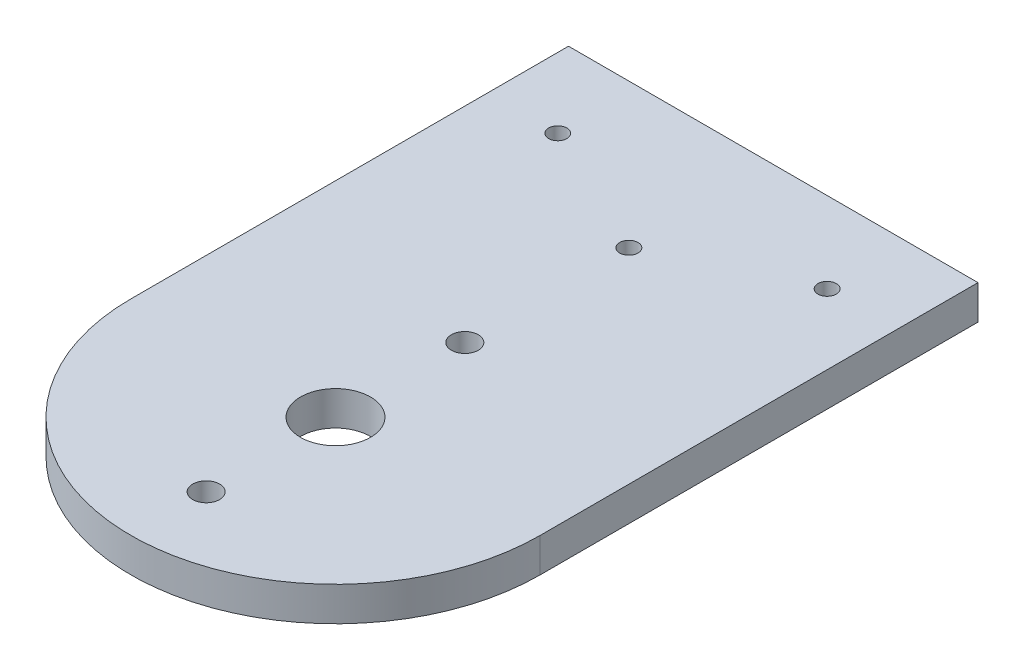
ISO-10303-21;
HEADER;
FILE_DESCRIPTION(('STEP AP214'),'2;1');
FILE_NAME('part.step','',(''),(''),'','','');
FILE_SCHEMA(('AUTOMOTIVE_DESIGN { 1 0 10303 214 1 1 1 1 }'));
ENDSEC;
DATA;
#1=APPLICATION_CONTEXT('core data for automotive mechanical design processes');
#2=APPLICATION_PROTOCOL_DEFINITION('international standard','automotive_design',2000,#1);
#3=PRODUCT_CONTEXT('',#1,'mechanical');
#4=PRODUCT('Part','Part','',(#3));
#5=PRODUCT_RELATED_PRODUCT_CATEGORY('part','',(#4));
#6=PRODUCT_DEFINITION_FORMATION('','',#4);
#7=PRODUCT_DEFINITION_CONTEXT('part definition',#1,'design');
#8=PRODUCT_DEFINITION('design','',#6,#7);
#9=PRODUCT_DEFINITION_SHAPE('','',#8);
#10=(LENGTH_UNIT() NAMED_UNIT(*) SI_UNIT(.MILLI.,.METRE.));
#11=(NAMED_UNIT(*) PLANE_ANGLE_UNIT() SI_UNIT($,.RADIAN.));
#12=(NAMED_UNIT(*) SI_UNIT($,.STERADIAN.) SOLID_ANGLE_UNIT());
#13=UNCERTAINTY_MEASURE_WITH_UNIT(LENGTH_MEASURE(1.E-05),#10,'distance_accuracy_value','');
#14=(GEOMETRIC_REPRESENTATION_CONTEXT(3) GLOBAL_UNCERTAINTY_ASSIGNED_CONTEXT((#13)) GLOBAL_UNIT_ASSIGNED_CONTEXT((#10,
#11,#12)) REPRESENTATION_CONTEXT('',''));
#15=CARTESIAN_POINT('',(0.,0.,0.));
#16=DIRECTION('',(0.,0.,1.));
#17=DIRECTION('',(1.,0.,0.));
#18=AXIS2_PLACEMENT_3D('',#15,#16,#17);
#19=CARTESIAN_POINT('',(-38.,-15.,90.2));
#20=DIRECTION('',(1.,0.,0.));
#21=DIRECTION('',(0.,0.,-1.));
#22=AXIS2_PLACEMENT_3D('',#19,#20,#21);
#23=PLANE('',#22);
#24=DIRECTION('',(0.,0.,1.));
#25=VECTOR('',#24,1.);
#26=CARTESIAN_POINT('',(-38.,-21.35,90.2));
#27=LINE('',#26,#25);
#28=CARTESIAN_POINT('',(-38.,-21.35,90.2));
#29=VERTEX_POINT('',#28);
#30=CARTESIAN_POINT('',(-38.,-21.35,171.45));
#31=VERTEX_POINT('',#30);
#32=EDGE_CURVE('E94',#29,#31,#27,.T.);
#33=ORIENTED_EDGE('',*,*,#32,.T.);
#34=DIRECTION('',(0.,-1.,0.));
#35=VECTOR('',#34,1.);
#36=CARTESIAN_POINT('',(-38.,-15.,171.45));
#37=LINE('',#36,#35);
#38=CARTESIAN_POINT('',(-38.,-15.,171.45));
#39=VERTEX_POINT('',#38);
#40=EDGE_CURVE('E11',#39,#31,#37,.T.);
#41=ORIENTED_EDGE('',*,*,#40,.F.);
#42=DIRECTION('',(0.,0.,1.));
#43=VECTOR('',#42,1.);
#44=CARTESIAN_POINT('',(-38.,-15.,90.2));
#45=LINE('',#44,#43);
#46=CARTESIAN_POINT('',(-38.,-15.,90.2));
#47=VERTEX_POINT('',#46);
#48=EDGE_CURVE('E86',#47,#39,#45,.T.);
#49=ORIENTED_EDGE('',*,*,#48,.F.);
#50=DIRECTION('',(0.,-1.,0.));
#51=VECTOR('',#50,1.);
#52=CARTESIAN_POINT('',(-38.,-15.,90.2));
#53=LINE('',#52,#51);
#54=EDGE_CURVE('E83',#47,#29,#53,.T.);
#55=ORIENTED_EDGE('',*,*,#54,.T.);
#56=EDGE_LOOP('',(#33,#41,#49,#55));
#57=FACE_BOUND('',#56,.T.);
#58=ADVANCED_FACE('F43',(#57),#23,.F.);
#59=CARTESIAN_POINT('',(38.,-15.,90.2));
#60=DIRECTION('',(-1.,0.,0.));
#61=DIRECTION('',(0.,0.,1.));
#62=AXIS2_PLACEMENT_3D('',#59,#60,#61);
#63=PLANE('',#62);
#64=DIRECTION('',(0.,0.,-1.));
#65=VECTOR('',#64,1.);
#66=CARTESIAN_POINT('',(38.,-21.35,90.2));
#67=LINE('',#66,#65);
#68=CARTESIAN_POINT('',(38.,-21.35,171.45));
#69=VERTEX_POINT('',#68);
#70=CARTESIAN_POINT('',(38.,-21.35,90.2));
#71=VERTEX_POINT('',#70);
#72=EDGE_CURVE('E75',#69,#71,#67,.T.);
#73=ORIENTED_EDGE('',*,*,#72,.T.);
#74=DIRECTION('',(0.,-1.,0.));
#75=VECTOR('',#74,1.);
#76=CARTESIAN_POINT('',(38.,-15.,90.2));
#77=LINE('',#76,#75);
#78=CARTESIAN_POINT('',(38.,-15.,90.2));
#79=VERTEX_POINT('',#78);
#80=EDGE_CURVE('E82',#79,#71,#77,.T.);
#81=ORIENTED_EDGE('',*,*,#80,.F.);
#82=DIRECTION('',(0.,0.,-1.));
#83=VECTOR('',#82,1.);
#84=CARTESIAN_POINT('',(38.,-15.,90.2));
#85=LINE('',#84,#83);
#86=CARTESIAN_POINT('',(38.,-15.,171.45));
#87=VERTEX_POINT('',#86);
#88=EDGE_CURVE('E108',#87,#79,#85,.T.);
#89=ORIENTED_EDGE('',*,*,#88,.F.);
#90=DIRECTION('',(0.,-1.,0.));
#91=VECTOR('',#90,1.);
#92=CARTESIAN_POINT('',(38.,-15.,171.45));
#93=LINE('',#92,#91);
#94=EDGE_CURVE('E51',#87,#69,#93,.T.);
#95=ORIENTED_EDGE('',*,*,#94,.T.);
#96=EDGE_LOOP('',(#73,#81,#89,#95));
#97=FACE_BOUND('',#96,.T.);
#98=ADVANCED_FACE('F106',(#97),#63,.F.);
#99=CARTESIAN_POINT('',(-38.,-15.,90.2));
#100=DIRECTION('',(0.,0.,1.));
#101=DIRECTION('',(1.,0.,0.));
#102=AXIS2_PLACEMENT_3D('',#99,#100,#101);
#103=PLANE('',#102);
#104=CARTESIAN_POINT('',(-30.,-18.175,90.2));
#105=DIRECTION('',(0.,0.,1.));
#106=DIRECTION('',(1.,0.,0.));
#107=AXIS2_PLACEMENT_3D('',#104,#105,#106);
#108=CIRCLE('',#107,2.);
#109=CARTESIAN_POINT('',(-28.,-18.175,90.2));
#110=VERTEX_POINT('',#109);
#111=EDGE_CURVE('E143',#110,#110,#108,.T.);
#112=ORIENTED_EDGE('',*,*,#111,.T.);
#113=EDGE_LOOP('',(#112));
#114=FACE_BOUND('',#113,.T.);
#115=CARTESIAN_POINT('',(30.,-18.175,90.2));
#116=DIRECTION('',(0.,0.,1.));
#117=DIRECTION('',(1.,0.,0.));
#118=AXIS2_PLACEMENT_3D('',#115,#116,#117);
#119=CIRCLE('',#118,2.);
#120=CARTESIAN_POINT('',(32.,-18.175,90.2));
#121=VERTEX_POINT('',#120);
#122=EDGE_CURVE('E142',#121,#121,#119,.T.);
#123=ORIENTED_EDGE('',*,*,#122,.T.);
#124=EDGE_LOOP('',(#123));
#125=FACE_BOUND('',#124,.T.);
#126=DIRECTION('',(-1.,0.,0.));
#127=VECTOR('',#126,1.);
#128=CARTESIAN_POINT('',(-38.,-21.35,90.2));
#129=LINE('',#128,#127);
#130=EDGE_CURVE('E76',#71,#29,#129,.T.);
#131=ORIENTED_EDGE('',*,*,#130,.T.);
#132=ORIENTED_EDGE('',*,*,#54,.F.);
#133=DIRECTION('',(-1.,0.,0.));
#134=VECTOR('',#133,1.);
#135=CARTESIAN_POINT('',(-38.,-15.,90.2));
#136=LINE('',#135,#134);
#137=EDGE_CURVE('E56',#79,#47,#136,.T.);
#138=ORIENTED_EDGE('',*,*,#137,.F.);
#139=ORIENTED_EDGE('',*,*,#80,.T.);
#140=EDGE_LOOP('',(#131,#132,#138,#139));
#141=FACE_BOUND('',#140,.T.);
#142=ADVANCED_FACE('F78',(#114,#125,#141),#103,.F.);
#143=CARTESIAN_POINT('',(0.,-15.,0.));
#144=DIRECTION('',(0.,1.,0.));
#145=DIRECTION('',(0.,0.,1.));
#146=AXIS2_PLACEMENT_3D('',#143,#144,#145);
#147=PLANE('',#146);
#148=CARTESIAN_POINT('',(0.,-15.,117.));
#149=DIRECTION('',(0.,1.,0.));
#150=DIRECTION('',(0.,0.,1.));
#151=AXIS2_PLACEMENT_3D('',#148,#149,#150);
#152=CIRCLE('',#151,1.7);
#153=CARTESIAN_POINT('',(0.,-15.,118.7));
#154=VERTEX_POINT('',#153);
#155=EDGE_CURVE('E152',#154,#154,#152,.T.);
#156=ORIENTED_EDGE('',*,*,#155,.F.);
#157=EDGE_LOOP('',(#156));
#158=FACE_BOUND('',#157,.T.);
#159=CARTESIAN_POINT('',(-25.,-15.,105.2));
#160=DIRECTION('',(0.,1.,0.));
#161=DIRECTION('',(0.,0.,1.));
#162=AXIS2_PLACEMENT_3D('',#159,#160,#161);
#163=CIRCLE('',#162,1.7);
#164=CARTESIAN_POINT('',(-25.,-15.,106.9));
#165=VERTEX_POINT('',#164);
#166=EDGE_CURVE('E145',#165,#165,#163,.T.);
#167=ORIENTED_EDGE('',*,*,#166,.F.);
#168=EDGE_LOOP('',(#167));
#169=FACE_BOUND('',#168,.T.);
#170=CARTESIAN_POINT('',(25.,-15.,105.2));
#171=DIRECTION('',(0.,1.,0.));
#172=DIRECTION('',(0.,0.,1.));
#173=AXIS2_PLACEMENT_3D('',#170,#171,#172);
#174=CIRCLE('',#173,1.7);
#175=CARTESIAN_POINT('',(25.,-15.,106.9));
#176=VERTEX_POINT('',#175);
#177=EDGE_CURVE('E146',#176,#176,#174,.T.);
#178=ORIENTED_EDGE('',*,*,#177,.F.);
#179=EDGE_LOOP('',(#178));
#180=FACE_BOUND('',#179,.T.);
#181=CARTESIAN_POINT('',(0.,-15.,147.45));
#182=DIRECTION('',(0.,1.,0.));
#183=DIRECTION('',(0.,0.,1.));
#184=AXIS2_PLACEMENT_3D('',#181,#182,#183);
#185=CIRCLE('',#184,2.5);
#186=CARTESIAN_POINT('',(0.,-15.,149.95));
#187=VERTEX_POINT('',#186);
#188=EDGE_CURVE('E128',#187,#187,#185,.T.);
#189=ORIENTED_EDGE('',*,*,#188,.F.);
#190=EDGE_LOOP('',(#189));
#191=FACE_BOUND('',#190,.T.);
#192=CARTESIAN_POINT('',(0.,-15.,195.45));
#193=DIRECTION('',(0.,1.,0.));
#194=DIRECTION('',(0.,0.,1.));
#195=AXIS2_PLACEMENT_3D('',#192,#193,#194);
#196=CIRCLE('',#195,2.5);
#197=CARTESIAN_POINT('',(0.,-15.,197.95));
#198=VERTEX_POINT('',#197);
#199=EDGE_CURVE('E133',#198,#198,#196,.T.);
#200=ORIENTED_EDGE('',*,*,#199,.F.);
#201=EDGE_LOOP('',(#200));
#202=FACE_BOUND('',#201,.T.);
#203=CARTESIAN_POINT('',(0.,-15.,171.45));
#204=DIRECTION('',(0.,1.,0.));
#205=DIRECTION('',(0.,0.,1.));
#206=AXIS2_PLACEMENT_3D('',#203,#204,#205);
#207=CIRCLE('',#206,6.5);
#208=CARTESIAN_POINT('',(0.,-15.,177.95));
#209=VERTEX_POINT('',#208);
#210=EDGE_CURVE('E117',#209,#209,#207,.T.);
#211=ORIENTED_EDGE('',*,*,#210,.F.);
#212=EDGE_LOOP('',(#211));
#213=FACE_BOUND('',#212,.T.);
#214=ORIENTED_EDGE('',*,*,#48,.T.);
#215=CARTESIAN_POINT('',(0.,-15.,171.45));
#216=DIRECTION('',(0.,1.,0.));
#217=DIRECTION('',(0.,0.,1.));
#218=AXIS2_PLACEMENT_3D('',#215,#216,#217);
#219=CIRCLE('',#218,38.);
#220=EDGE_CURVE('E98',#39,#87,#219,.T.);
#221=ORIENTED_EDGE('',*,*,#220,.T.);
#222=ORIENTED_EDGE('',*,*,#88,.T.);
#223=ORIENTED_EDGE('',*,*,#137,.T.);
#224=EDGE_LOOP('',(#214,#221,#222,#223));
#225=FACE_BOUND('',#224,.T.);
#226=ADVANCED_FACE('F112',(#158,#169,#180,#191,#202,#213,#225),#147,.T.);
#227=CARTESIAN_POINT('',(0.,-21.35,0.));
#228=DIRECTION('',(0.,1.,0.));
#229=DIRECTION('',(0.,0.,1.));
#230=AXIS2_PLACEMENT_3D('',#227,#228,#229);
#231=PLANE('',#230);
#232=CARTESIAN_POINT('',(0.,-21.35,117.));
#233=DIRECTION('',(0.,1.,0.));
#234=DIRECTION('',(0.,0.,1.));
#235=AXIS2_PLACEMENT_3D('',#232,#233,#234);
#236=CIRCLE('',#235,1.7);
#237=CARTESIAN_POINT('',(0.,-21.35,118.7));
#238=VERTEX_POINT('',#237);
#239=EDGE_CURVE('E162',#238,#238,#236,.T.);
#240=ORIENTED_EDGE('',*,*,#239,.T.);
#241=EDGE_LOOP('',(#240));
#242=FACE_BOUND('',#241,.T.);
#243=CARTESIAN_POINT('',(-25.,-21.35,105.2));
#244=DIRECTION('',(0.,1.,0.));
#245=DIRECTION('',(0.,0.,1.));
#246=AXIS2_PLACEMENT_3D('',#243,#244,#245);
#247=CIRCLE('',#246,1.7);
#248=CARTESIAN_POINT('',(-25.,-21.35,106.9));
#249=VERTEX_POINT('',#248);
#250=EDGE_CURVE('E156',#249,#249,#247,.T.);
#251=ORIENTED_EDGE('',*,*,#250,.T.);
#252=EDGE_LOOP('',(#251));
#253=FACE_BOUND('',#252,.T.);
#254=CARTESIAN_POINT('',(25.,-21.35,105.2));
#255=DIRECTION('',(0.,1.,0.));
#256=DIRECTION('',(0.,0.,1.));
#257=AXIS2_PLACEMENT_3D('',#254,#255,#256);
#258=CIRCLE('',#257,1.7);
#259=CARTESIAN_POINT('',(25.,-21.35,106.9));
#260=VERTEX_POINT('',#259);
#261=EDGE_CURVE('E153',#260,#260,#258,.T.);
#262=ORIENTED_EDGE('',*,*,#261,.T.);
#263=EDGE_LOOP('',(#262));
#264=FACE_BOUND('',#263,.T.);
#265=CARTESIAN_POINT('',(0.,-21.35,147.45));
#266=DIRECTION('',(0.,1.,0.));
#267=DIRECTION('',(0.,0.,1.));
#268=AXIS2_PLACEMENT_3D('',#265,#266,#267);
#269=CIRCLE('',#268,2.5);
#270=CARTESIAN_POINT('',(0.,-21.35,149.95));
#271=VERTEX_POINT('',#270);
#272=EDGE_CURVE('E130',#271,#271,#269,.T.);
#273=ORIENTED_EDGE('',*,*,#272,.T.);
#274=EDGE_LOOP('',(#273));
#275=FACE_BOUND('',#274,.T.);
#276=CARTESIAN_POINT('',(0.,-21.35,195.45));
#277=DIRECTION('',(0.,1.,0.));
#278=DIRECTION('',(0.,0.,1.));
#279=AXIS2_PLACEMENT_3D('',#276,#277,#278);
#280=CIRCLE('',#279,2.5);
#281=CARTESIAN_POINT('',(0.,-21.35,197.95));
#282=VERTEX_POINT('',#281);
#283=EDGE_CURVE('E124',#282,#282,#280,.T.);
#284=ORIENTED_EDGE('',*,*,#283,.T.);
#285=EDGE_LOOP('',(#284));
#286=FACE_BOUND('',#285,.T.);
#287=CARTESIAN_POINT('',(0.,-21.35,171.45));
#288=DIRECTION('',(0.,1.,0.));
#289=DIRECTION('',(0.,0.,1.));
#290=AXIS2_PLACEMENT_3D('',#287,#288,#289);
#291=CIRCLE('',#290,6.5);
#292=CARTESIAN_POINT('',(0.,-21.35,177.95));
#293=VERTEX_POINT('',#292);
#294=EDGE_CURVE('E119',#293,#293,#291,.T.);
#295=ORIENTED_EDGE('',*,*,#294,.T.);
#296=EDGE_LOOP('',(#295));
#297=FACE_BOUND('',#296,.T.);
#298=ORIENTED_EDGE('',*,*,#72,.F.);
#299=CARTESIAN_POINT('',(0.,-21.35,171.45));
#300=DIRECTION('',(0.,1.,0.));
#301=DIRECTION('',(0.,0.,1.));
#302=AXIS2_PLACEMENT_3D('',#299,#300,#301);
#303=CIRCLE('',#302,38.);
#304=EDGE_CURVE('E92',#31,#69,#303,.T.);
#305=ORIENTED_EDGE('',*,*,#304,.F.);
#306=ORIENTED_EDGE('',*,*,#32,.F.);
#307=ORIENTED_EDGE('',*,*,#130,.F.);
#308=EDGE_LOOP('',(#298,#305,#306,#307));
#309=FACE_BOUND('',#308,.T.);
#310=ADVANCED_FACE('F93',(#242,#253,#264,#275,#286,#297,#309),#231,.F.);
#311=CARTESIAN_POINT('',(0.,-15.,171.45));
#312=DIRECTION('',(0.,-1.,0.));
#313=DIRECTION('',(0.,0.,-1.));
#314=AXIS2_PLACEMENT_3D('',#311,#312,#313);
#315=CYLINDRICAL_SURFACE('',#314,38.);
#316=ORIENTED_EDGE('',*,*,#220,.F.);
#317=ORIENTED_EDGE('',*,*,#40,.T.);
#318=ORIENTED_EDGE('',*,*,#304,.T.);
#319=ORIENTED_EDGE('',*,*,#94,.F.);
#320=EDGE_LOOP('',(#316,#317,#318,#319));
#321=FACE_BOUND('',#320,.T.);
#322=ADVANCED_FACE('F111',(#321),#315,.T.);
#323=CARTESIAN_POINT('',(0.,-15.,171.45));
#324=DIRECTION('',(0.,-1.,0.));
#325=DIRECTION('',(0.,0.,-1.));
#326=AXIS2_PLACEMENT_3D('',#323,#324,#325);
#327=CYLINDRICAL_SURFACE('',#326,6.5);
#328=ORIENTED_EDGE('',*,*,#210,.T.);
#329=EDGE_LOOP('',(#328));
#330=FACE_BOUND('',#329,.T.);
#331=ORIENTED_EDGE('',*,*,#294,.F.);
#332=EDGE_LOOP('',(#331));
#333=FACE_BOUND('',#332,.T.);
#334=ADVANCED_FACE('F183',(#330,#333),#327,.F.);
#335=CARTESIAN_POINT('',(0.,-15.,195.45));
#336=DIRECTION('',(0.,-1.,0.));
#337=DIRECTION('',(0.,0.,-1.));
#338=AXIS2_PLACEMENT_3D('',#335,#336,#337);
#339=CYLINDRICAL_SURFACE('',#338,2.5);
#340=ORIENTED_EDGE('',*,*,#199,.T.);
#341=EDGE_LOOP('',(#340));
#342=FACE_BOUND('',#341,.T.);
#343=ORIENTED_EDGE('',*,*,#283,.F.);
#344=EDGE_LOOP('',(#343));
#345=FACE_BOUND('',#344,.T.);
#346=ADVANCED_FACE('F190',(#342,#345),#339,.F.);
#347=CARTESIAN_POINT('',(0.,-15.,147.45));
#348=DIRECTION('',(0.,-1.,0.));
#349=DIRECTION('',(0.,0.,-1.));
#350=AXIS2_PLACEMENT_3D('',#347,#348,#349);
#351=CYLINDRICAL_SURFACE('',#350,2.5);
#352=ORIENTED_EDGE('',*,*,#188,.T.);
#353=EDGE_LOOP('',(#352));
#354=FACE_BOUND('',#353,.T.);
#355=ORIENTED_EDGE('',*,*,#272,.F.);
#356=EDGE_LOOP('',(#355));
#357=FACE_BOUND('',#356,.T.);
#358=ADVANCED_FACE('F217',(#354,#357),#351,.F.);
#359=CARTESIAN_POINT('',(30.,-18.175,98.2));
#360=DIRECTION('',(0.,0.,-1.));
#361=DIRECTION('',(-1.,0.,0.));
#362=AXIS2_PLACEMENT_3D('',#359,#360,#361);
#363=CYLINDRICAL_SURFACE('',#362,2.);
#364=CARTESIAN_POINT('',(30.,-18.175,98.2));
#365=DIRECTION('',(0.,0.,1.));
#366=DIRECTION('',(1.,0.,0.));
#367=AXIS2_PLACEMENT_3D('',#364,#365,#366);
#368=CIRCLE('',#367,2.);
#369=CARTESIAN_POINT('',(32.,-18.175,98.2));
#370=VERTEX_POINT('',#369);
#371=EDGE_CURVE('E140',#370,#370,#368,.T.);
#372=ORIENTED_EDGE('',*,*,#371,.T.);
#373=EDGE_LOOP('',(#372));
#374=FACE_BOUND('',#373,.T.);
#375=ORIENTED_EDGE('',*,*,#122,.F.);
#376=EDGE_LOOP('',(#375));
#377=FACE_BOUND('',#376,.T.);
#378=ADVANCED_FACE('F220',(#374,#377),#363,.F.);
#379=CARTESIAN_POINT('',(30.,-18.175,98.2));
#380=DIRECTION('',(0.,0.,1.));
#381=DIRECTION('',(1.,0.,0.));
#382=AXIS2_PLACEMENT_3D('',#379,#380,#381);
#383=PLANE('',#382);
#384=ORIENTED_EDGE('',*,*,#371,.F.);
#385=EDGE_LOOP('',(#384));
#386=FACE_BOUND('',#385,.T.);
#387=ADVANCED_FACE('F218',(#386),#383,.F.);
#388=CARTESIAN_POINT('',(-30.,-18.175,98.2));
#389=DIRECTION('',(0.,0.,-1.));
#390=DIRECTION('',(-1.,0.,0.));
#391=AXIS2_PLACEMENT_3D('',#388,#389,#390);
#392=CYLINDRICAL_SURFACE('',#391,2.);
#393=CARTESIAN_POINT('',(-30.,-18.175,98.2));
#394=DIRECTION('',(0.,0.,1.));
#395=DIRECTION('',(1.,0.,0.));
#396=AXIS2_PLACEMENT_3D('',#393,#394,#395);
#397=CIRCLE('',#396,2.);
#398=CARTESIAN_POINT('',(-28.,-18.175,98.2));
#399=VERTEX_POINT('',#398);
#400=EDGE_CURVE('E126',#399,#399,#397,.T.);
#401=ORIENTED_EDGE('',*,*,#400,.T.);
#402=EDGE_LOOP('',(#401));
#403=FACE_BOUND('',#402,.T.);
#404=ORIENTED_EDGE('',*,*,#111,.F.);
#405=EDGE_LOOP('',(#404));
#406=FACE_BOUND('',#405,.T.);
#407=ADVANCED_FACE('F222',(#403,#406),#392,.F.);
#408=CARTESIAN_POINT('',(-30.,-18.175,98.2));
#409=DIRECTION('',(0.,0.,1.));
#410=DIRECTION('',(1.,0.,0.));
#411=AXIS2_PLACEMENT_3D('',#408,#409,#410);
#412=PLANE('',#411);
#413=ORIENTED_EDGE('',*,*,#400,.F.);
#414=EDGE_LOOP('',(#413));
#415=FACE_BOUND('',#414,.T.);
#416=ADVANCED_FACE('F266',(#415),#412,.F.);
#417=CARTESIAN_POINT('',(25.,-15.,105.2));
#418=DIRECTION('',(0.,-1.,0.));
#419=DIRECTION('',(0.,0.,-1.));
#420=AXIS2_PLACEMENT_3D('',#417,#418,#419);
#421=CYLINDRICAL_SURFACE('',#420,1.7);
#422=ORIENTED_EDGE('',*,*,#177,.T.);
#423=EDGE_LOOP('',(#422));
#424=FACE_BOUND('',#423,.T.);
#425=ORIENTED_EDGE('',*,*,#261,.F.);
#426=EDGE_LOOP('',(#425));
#427=FACE_BOUND('',#426,.T.);
#428=ADVANCED_FACE('F278',(#424,#427),#421,.F.);
#429=CARTESIAN_POINT('',(-25.,-15.,105.2));
#430=DIRECTION('',(0.,-1.,0.));
#431=DIRECTION('',(0.,0.,-1.));
#432=AXIS2_PLACEMENT_3D('',#429,#430,#431);
#433=CYLINDRICAL_SURFACE('',#432,1.7);
#434=ORIENTED_EDGE('',*,*,#166,.T.);
#435=EDGE_LOOP('',(#434));
#436=FACE_BOUND('',#435,.T.);
#437=ORIENTED_EDGE('',*,*,#250,.F.);
#438=EDGE_LOOP('',(#437));
#439=FACE_BOUND('',#438,.T.);
#440=ADVANCED_FACE('F284',(#436,#439),#433,.F.);
#441=CARTESIAN_POINT('',(0.,-15.,117.));
#442=DIRECTION('',(0.,-1.,0.));
#443=DIRECTION('',(0.,0.,-1.));
#444=AXIS2_PLACEMENT_3D('',#441,#442,#443);
#445=CYLINDRICAL_SURFACE('',#444,1.7);
#446=ORIENTED_EDGE('',*,*,#155,.T.);
#447=EDGE_LOOP('',(#446));
#448=FACE_BOUND('',#447,.T.);
#449=ORIENTED_EDGE('',*,*,#239,.F.);
#450=EDGE_LOOP('',(#449));
#451=FACE_BOUND('',#450,.T.);
#452=ADVANCED_FACE('F166',(#448,#451),#445,.F.);
#453=CLOSED_SHELL('',(#58,#98,#142,#226,#310,#322,#334,#346,#358,#378,#387,#407,#416,#428,#440,#452));
#454=MANIFOLD_SOLID_BREP('B2',#453);
#455=ADVANCED_BREP_SHAPE_REPRESENTATION('',(#18,#454),#14);
#456=SHAPE_DEFINITION_REPRESENTATION(#9,#455);
ENDSEC;
END-ISO-10303-21;
